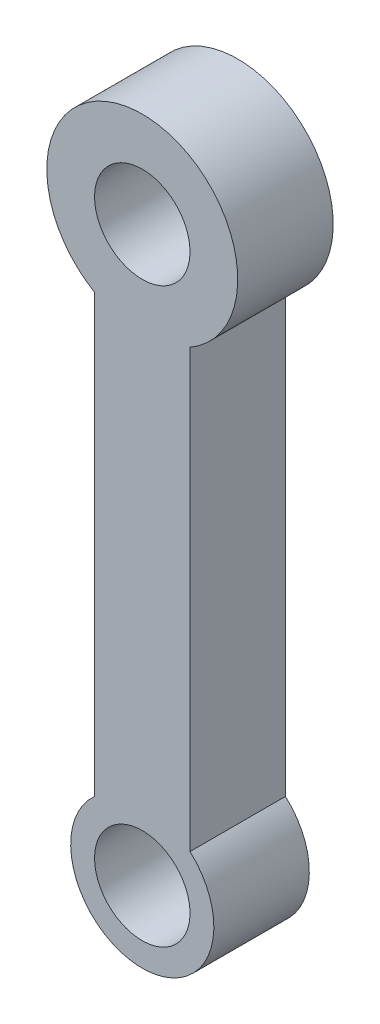
ISO-10303-21;
HEADER;
FILE_DESCRIPTION(('STEP AP214'),'2;1');
FILE_NAME('part.step','',(''),(''),'','','');
FILE_SCHEMA(('AUTOMOTIVE_DESIGN { 1 0 10303 214 1 1 1 1 }'));
ENDSEC;
DATA;
#1=APPLICATION_CONTEXT('core data for automotive mechanical design processes');
#2=APPLICATION_PROTOCOL_DEFINITION('international standard','automotive_design',2000,#1);
#3=PRODUCT_CONTEXT('',#1,'mechanical');
#4=PRODUCT('Part','Part','',(#3));
#5=PRODUCT_RELATED_PRODUCT_CATEGORY('part','',(#4));
#6=PRODUCT_DEFINITION_FORMATION('','',#4);
#7=PRODUCT_DEFINITION_CONTEXT('part definition',#1,'design');
#8=PRODUCT_DEFINITION('design','',#6,#7);
#9=PRODUCT_DEFINITION_SHAPE('','',#8);
#10=(LENGTH_UNIT() NAMED_UNIT(*) SI_UNIT(.MILLI.,.METRE.));
#11=(NAMED_UNIT(*) PLANE_ANGLE_UNIT() SI_UNIT($,.RADIAN.));
#12=(NAMED_UNIT(*) SI_UNIT($,.STERADIAN.) SOLID_ANGLE_UNIT());
#13=UNCERTAINTY_MEASURE_WITH_UNIT(LENGTH_MEASURE(1.E-05),#10,'distance_accuracy_value','');
#14=(GEOMETRIC_REPRESENTATION_CONTEXT(3) GLOBAL_UNCERTAINTY_ASSIGNED_CONTEXT((#13)) GLOBAL_UNIT_ASSIGNED_CONTEXT((#10,
#11,#12)) REPRESENTATION_CONTEXT('',''));
#15=CARTESIAN_POINT('',(0.,0.,0.));
#16=DIRECTION('',(0.,0.,1.));
#17=DIRECTION('',(1.,0.,0.));
#18=AXIS2_PLACEMENT_3D('',#15,#16,#17);
#19=CARTESIAN_POINT('',(0.,45.6978118429806,20.));
#20=DIRECTION('',(0.,0.,-1.));
#21=DIRECTION('',(-1.,0.,0.));
#22=AXIS2_PLACEMENT_3D('',#19,#20,#21);
#23=CYLINDRICAL_SURFACE('',#22,20.);
#24=CARTESIAN_POINT('',(0.,45.6978118429806,0.));
#25=DIRECTION('',(0.,0.,1.));
#26=DIRECTION('',(1.,0.,0.));
#27=AXIS2_PLACEMENT_3D('',#24,#25,#26);
#28=CIRCLE('',#27,20.);
#29=CARTESIAN_POINT('',(10.,28.3773037672918,0.));
#30=VERTEX_POINT('',#29);
#31=CARTESIAN_POINT('',(-10.,28.3773037672918,0.));
#32=VERTEX_POINT('',#31);
#33=EDGE_CURVE('E111',#30,#32,#28,.T.);
#34=ORIENTED_EDGE('',*,*,#33,.T.);
#35=DIRECTION('',(0.,0.,-1.));
#36=VECTOR('',#35,1.);
#37=CARTESIAN_POINT('',(-10.,28.3773037672918,20.));
#38=LINE('',#37,#36);
#39=CARTESIAN_POINT('',(-10.,28.3773037672918,20.));
#40=VERTEX_POINT('',#39);
#41=EDGE_CURVE('E11',#40,#32,#38,.T.);
#42=ORIENTED_EDGE('',*,*,#41,.F.);
#43=CARTESIAN_POINT('',(0.,45.6978118429806,20.));
#44=DIRECTION('',(0.,0.,1.));
#45=DIRECTION('',(1.,0.,0.));
#46=AXIS2_PLACEMENT_3D('',#43,#44,#45);
#47=CIRCLE('',#46,20.);
#48=CARTESIAN_POINT('',(10.,28.3773037672918,20.));
#49=VERTEX_POINT('',#48);
#50=EDGE_CURVE('E95',#49,#40,#47,.T.);
#51=ORIENTED_EDGE('',*,*,#50,.F.);
#52=DIRECTION('',(0.,0.,-1.));
#53=VECTOR('',#52,1.);
#54=CARTESIAN_POINT('',(10.,28.3773037672918,20.));
#55=LINE('',#54,#53);
#56=EDGE_CURVE('E107',#49,#30,#55,.T.);
#57=ORIENTED_EDGE('',*,*,#56,.T.);
#58=EDGE_LOOP('',(#34,#42,#51,#57));
#59=FACE_BOUND('',#58,.T.);
#60=ADVANCED_FACE('F43',(#59),#23,.T.);
#61=CARTESIAN_POINT('',(-10.,28.3773037672918,20.));
#62=DIRECTION('',(1.,0.,0.));
#63=DIRECTION('',(0.,1.,0.));
#64=AXIS2_PLACEMENT_3D('',#61,#62,#63);
#65=PLANE('',#64);
#66=DIRECTION('',(0.,-1.,0.));
#67=VECTOR('',#66,1.);
#68=CARTESIAN_POINT('',(-10.,28.3773037672918,0.));
#69=LINE('',#68,#67);
#70=CARTESIAN_POINT('',(-10.,-63.1218482695205,0.));
#71=VERTEX_POINT('',#70);
#72=EDGE_CURVE('E100',#32,#71,#69,.T.);
#73=ORIENTED_EDGE('',*,*,#72,.T.);
#74=DIRECTION('',(0.,0.,-1.));
#75=VECTOR('',#74,1.);
#76=CARTESIAN_POINT('',(-10.,-63.1218482695205,20.));
#77=LINE('',#76,#75);
#78=CARTESIAN_POINT('',(-10.,-63.1218482695205,20.));
#79=VERTEX_POINT('',#78);
#80=EDGE_CURVE('E52',#79,#71,#77,.T.);
#81=ORIENTED_EDGE('',*,*,#80,.F.);
#82=DIRECTION('',(0.,-1.,0.));
#83=VECTOR('',#82,1.);
#84=CARTESIAN_POINT('',(-10.,28.3773037672918,20.));
#85=LINE('',#84,#83);
#86=EDGE_CURVE('E90',#40,#79,#85,.T.);
#87=ORIENTED_EDGE('',*,*,#86,.F.);
#88=ORIENTED_EDGE('',*,*,#41,.T.);
#89=EDGE_LOOP('',(#73,#81,#87,#88));
#90=FACE_BOUND('',#89,.T.);
#91=ADVANCED_FACE('F99',(#90),#65,.F.);
#92=CARTESIAN_POINT('',(0.,-74.3021881570194,20.));
#93=DIRECTION('',(0.,0.,-1.));
#94=DIRECTION('',(-1.,0.,0.));
#95=AXIS2_PLACEMENT_3D('',#92,#93,#94);
#96=CYLINDRICAL_SURFACE('',#95,15.);
#97=CARTESIAN_POINT('',(0.,-74.3021881570194,0.));
#98=DIRECTION('',(0.,0.,1.));
#99=DIRECTION('',(1.,0.,0.));
#100=AXIS2_PLACEMENT_3D('',#97,#98,#99);
#101=CIRCLE('',#100,15.);
#102=CARTESIAN_POINT('',(9.99999999999999,-63.1218482695205,0.));
#103=VERTEX_POINT('',#102);
#104=EDGE_CURVE('E77',#71,#103,#101,.T.);
#105=ORIENTED_EDGE('',*,*,#104,.T.);
#106=DIRECTION('',(0.,0.,-1.));
#107=VECTOR('',#106,1.);
#108=CARTESIAN_POINT('',(9.99999999999999,-63.1218482695205,20.));
#109=LINE('',#108,#107);
#110=CARTESIAN_POINT('',(9.99999999999999,-63.1218482695205,20.));
#111=VERTEX_POINT('',#110);
#112=EDGE_CURVE('E102',#111,#103,#109,.T.);
#113=ORIENTED_EDGE('',*,*,#112,.F.);
#114=CARTESIAN_POINT('',(0.,-74.3021881570194,20.));
#115=DIRECTION('',(0.,0.,1.));
#116=DIRECTION('',(1.,0.,0.));
#117=AXIS2_PLACEMENT_3D('',#114,#115,#116);
#118=CIRCLE('',#117,15.);
#119=EDGE_CURVE('E93',#79,#111,#118,.T.);
#120=ORIENTED_EDGE('',*,*,#119,.F.);
#121=ORIENTED_EDGE('',*,*,#80,.T.);
#122=EDGE_LOOP('',(#105,#113,#120,#121));
#123=FACE_BOUND('',#122,.T.);
#124=ADVANCED_FACE('F103',(#123),#96,.T.);
#125=CARTESIAN_POINT('',(10.,-63.1218482695205,20.));
#126=DIRECTION('',(-1.,0.,0.));
#127=DIRECTION('',(0.,-1.,0.));
#128=AXIS2_PLACEMENT_3D('',#125,#126,#127);
#129=PLANE('',#128);
#130=DIRECTION('',(0.,1.,0.));
#131=VECTOR('',#130,1.);
#132=CARTESIAN_POINT('',(10.,-63.1218482695205,0.));
#133=LINE('',#132,#131);
#134=EDGE_CURVE('E83',#103,#30,#133,.T.);
#135=ORIENTED_EDGE('',*,*,#134,.T.);
#136=ORIENTED_EDGE('',*,*,#56,.F.);
#137=DIRECTION('',(0.,1.,0.));
#138=VECTOR('',#137,1.);
#139=CARTESIAN_POINT('',(10.,-63.1218482695205,20.));
#140=LINE('',#139,#138);
#141=EDGE_CURVE('E60',#111,#49,#140,.T.);
#142=ORIENTED_EDGE('',*,*,#141,.F.);
#143=ORIENTED_EDGE('',*,*,#112,.T.);
#144=EDGE_LOOP('',(#135,#136,#142,#143));
#145=FACE_BOUND('',#144,.T.);
#146=ADVANCED_FACE('F125',(#145),#129,.F.);
#147=CARTESIAN_POINT('',(0.,45.6978118429806,20.));
#148=DIRECTION('',(0.,0.,1.));
#149=DIRECTION('',(1.,0.,0.));
#150=AXIS2_PLACEMENT_3D('',#147,#148,#149);
#151=PLANE('',#150);
#152=CARTESIAN_POINT('',(0.,45.6978118429806,20.));
#153=DIRECTION('',(0.,0.,-1.));
#154=DIRECTION('',(-1.,0.,0.));
#155=AXIS2_PLACEMENT_3D('',#152,#153,#154);
#156=CIRCLE('',#155,10.);
#157=CARTESIAN_POINT('',(-10.,45.6978118429806,20.));
#158=VERTEX_POINT('',#157);
#159=EDGE_CURVE('E115',#158,#158,#156,.T.);
#160=ORIENTED_EDGE('',*,*,#159,.T.);
#161=EDGE_LOOP('',(#160));
#162=FACE_BOUND('',#161,.T.);
#163=CARTESIAN_POINT('',(0.,-74.3021881570194,20.));
#164=DIRECTION('',(0.,0.,-1.));
#165=DIRECTION('',(-1.,0.,0.));
#166=AXIS2_PLACEMENT_3D('',#163,#164,#165);
#167=CIRCLE('',#166,10.);
#168=CARTESIAN_POINT('',(-10.,-74.3021881570194,20.));
#169=VERTEX_POINT('',#168);
#170=EDGE_CURVE('E132',#169,#169,#167,.T.);
#171=ORIENTED_EDGE('',*,*,#170,.T.);
#172=EDGE_LOOP('',(#171));
#173=FACE_BOUND('',#172,.T.);
#174=ORIENTED_EDGE('',*,*,#50,.T.);
#175=ORIENTED_EDGE('',*,*,#86,.T.);
#176=ORIENTED_EDGE('',*,*,#119,.T.);
#177=ORIENTED_EDGE('',*,*,#141,.T.);
#178=EDGE_LOOP('',(#174,#175,#176,#177));
#179=FACE_BOUND('',#178,.T.);
#180=ADVANCED_FACE('F91',(#162,#173,#179),#151,.T.);
#181=CARTESIAN_POINT('',(0.,45.6978118429806,0.));
#182=DIRECTION('',(0.,0.,1.));
#183=DIRECTION('',(1.,0.,0.));
#184=AXIS2_PLACEMENT_3D('',#181,#182,#183);
#185=PLANE('',#184);
#186=CARTESIAN_POINT('',(0.,45.6978118429806,0.));
#187=DIRECTION('',(0.,0.,-1.));
#188=DIRECTION('',(-1.,0.,0.));
#189=AXIS2_PLACEMENT_3D('',#186,#187,#188);
#190=CIRCLE('',#189,10.);
#191=CARTESIAN_POINT('',(-10.,45.6978118429806,0.));
#192=VERTEX_POINT('',#191);
#193=EDGE_CURVE('E140',#192,#192,#190,.T.);
#194=ORIENTED_EDGE('',*,*,#193,.F.);
#195=EDGE_LOOP('',(#194));
#196=FACE_BOUND('',#195,.T.);
#197=CARTESIAN_POINT('',(0.,-74.3021881570194,0.));
#198=DIRECTION('',(0.,0.,-1.));
#199=DIRECTION('',(-1.,0.,0.));
#200=AXIS2_PLACEMENT_3D('',#197,#198,#199);
#201=CIRCLE('',#200,10.);
#202=CARTESIAN_POINT('',(-10.,-74.3021881570194,0.));
#203=VERTEX_POINT('',#202);
#204=EDGE_CURVE('E136',#203,#203,#201,.T.);
#205=ORIENTED_EDGE('',*,*,#204,.F.);
#206=EDGE_LOOP('',(#205));
#207=FACE_BOUND('',#206,.T.);
#208=ORIENTED_EDGE('',*,*,#33,.F.);
#209=ORIENTED_EDGE('',*,*,#134,.F.);
#210=ORIENTED_EDGE('',*,*,#104,.F.);
#211=ORIENTED_EDGE('',*,*,#72,.F.);
#212=EDGE_LOOP('',(#208,#209,#210,#211));
#213=FACE_BOUND('',#212,.T.);
#214=ADVANCED_FACE('F128',(#196,#207,#213),#185,.F.);
#215=CARTESIAN_POINT('',(0.,-74.3021881570194,20.));
#216=DIRECTION('',(0.,0.,-1.));
#217=DIRECTION('',(-1.,0.,0.));
#218=AXIS2_PLACEMENT_3D('',#215,#216,#217);
#219=CYLINDRICAL_SURFACE('',#218,10.);
#220=ORIENTED_EDGE('',*,*,#170,.F.);
#221=EDGE_LOOP('',(#220));
#222=FACE_BOUND('',#221,.T.);
#223=ORIENTED_EDGE('',*,*,#204,.T.);
#224=EDGE_LOOP('',(#223));
#225=FACE_BOUND('',#224,.T.);
#226=ADVANCED_FACE('F153',(#222,#225),#219,.F.);
#227=CARTESIAN_POINT('',(0.,45.6978118429806,20.));
#228=DIRECTION('',(0.,0.,-1.));
#229=DIRECTION('',(-1.,0.,0.));
#230=AXIS2_PLACEMENT_3D('',#227,#228,#229);
#231=CYLINDRICAL_SURFACE('',#230,10.);
#232=ORIENTED_EDGE('',*,*,#159,.F.);
#233=EDGE_LOOP('',(#232));
#234=FACE_BOUND('',#233,.T.);
#235=ORIENTED_EDGE('',*,*,#193,.T.);
#236=EDGE_LOOP('',(#235));
#237=FACE_BOUND('',#236,.T.);
#238=ADVANCED_FACE('F150',(#234,#237),#231,.F.);
#239=CLOSED_SHELL('',(#60,#91,#124,#146,#180,#214,#226,#238));
#240=MANIFOLD_SOLID_BREP('B2',#239);
#241=ADVANCED_BREP_SHAPE_REPRESENTATION('',(#18,#240),#14);
#242=SHAPE_DEFINITION_REPRESENTATION(#9,#241);
ENDSEC;
END-ISO-10303-21;
